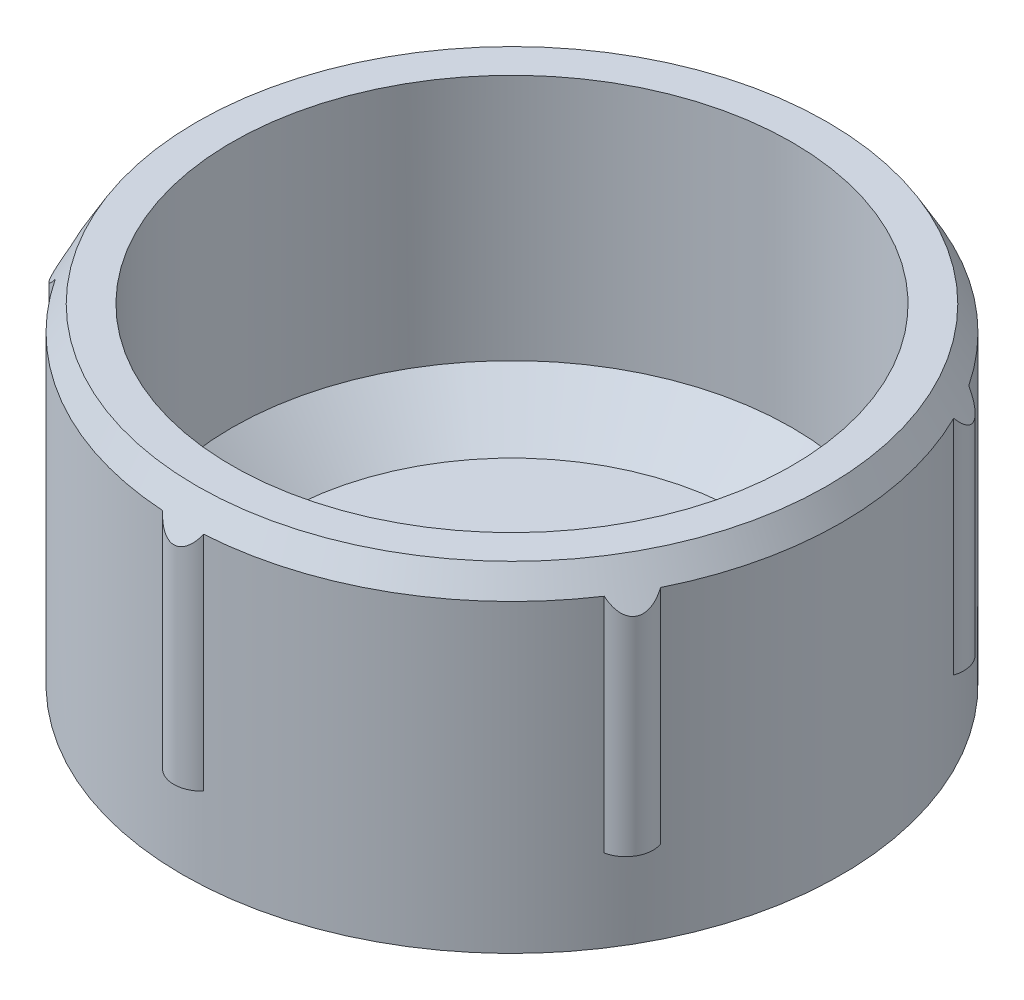
ISO-10303-21;
HEADER;
FILE_DESCRIPTION(('STEP AP214'),'2;1');
FILE_NAME('part.step','',(''),(''),'','','');
FILE_SCHEMA(('AUTOMOTIVE_DESIGN { 1 0 10303 214 1 1 1 1 }'));
ENDSEC;
DATA;
#1=APPLICATION_CONTEXT('core data for automotive mechanical design processes');
#2=APPLICATION_PROTOCOL_DEFINITION('international standard','automotive_design',2000,#1);
#3=PRODUCT_CONTEXT('',#1,'mechanical');
#4=PRODUCT('Part','Part','',(#3));
#5=PRODUCT_RELATED_PRODUCT_CATEGORY('part','',(#4));
#6=PRODUCT_DEFINITION_FORMATION('','',#4);
#7=PRODUCT_DEFINITION_CONTEXT('part definition',#1,'design');
#8=PRODUCT_DEFINITION('design','',#6,#7);
#9=PRODUCT_DEFINITION_SHAPE('','',#8);
#10=(LENGTH_UNIT() NAMED_UNIT(*) SI_UNIT(.MILLI.,.METRE.));
#11=(NAMED_UNIT(*) PLANE_ANGLE_UNIT() SI_UNIT($,.RADIAN.));
#12=(NAMED_UNIT(*) SI_UNIT($,.STERADIAN.) SOLID_ANGLE_UNIT());
#13=UNCERTAINTY_MEASURE_WITH_UNIT(LENGTH_MEASURE(1.E-05),#10,'distance_accuracy_value','');
#14=(GEOMETRIC_REPRESENTATION_CONTEXT(3) GLOBAL_UNCERTAINTY_ASSIGNED_CONTEXT((#13)) GLOBAL_UNIT_ASSIGNED_CONTEXT((#10,
#11,#12)) REPRESENTATION_CONTEXT('',''));
#15=CARTESIAN_POINT('',(0.,0.,0.));
#16=DIRECTION('',(0.,0.,1.));
#17=DIRECTION('',(1.,0.,0.));
#18=AXIS2_PLACEMENT_3D('',#15,#16,#17);
#19=CARTESIAN_POINT('',(-20.,20.,0.));
#20=DIRECTION('',(0.,-1.,0.));
#21=DIRECTION('',(0.,0.,-1.));
#22=AXIS2_PLACEMENT_3D('',#19,#20,#21);
#23=PLANE('',#22);
#24=CARTESIAN_POINT('',(0.,20.,0.));
#25=DIRECTION('',(0.,-1.,0.));
#26=DIRECTION('',(0.,0.,-1.));
#27=AXIS2_PLACEMENT_3D('',#24,#25,#26);
#28=CIRCLE('',#27,17.);
#29=CARTESIAN_POINT('',(0.,20.,-17.));
#30=VERTEX_POINT('',#29);
#31=EDGE_CURVE('E249',#30,#30,#28,.T.);
#32=ORIENTED_EDGE('',*,*,#31,.T.);
#33=EDGE_LOOP('',(#32));
#34=FACE_BOUND('',#33,.T.);
#35=CARTESIAN_POINT('',(0.,20.,0.));
#36=DIRECTION('',(0.,-1.,0.));
#37=DIRECTION('',(0.,0.,-1.));
#38=AXIS2_PLACEMENT_3D('',#35,#36,#37);
#39=CIRCLE('',#38,19.1339745962156);
#40=CARTESIAN_POINT('',(0.,20.,-19.1339745962156));
#41=VERTEX_POINT('',#40);
#42=EDGE_CURVE('E380',#41,#41,#39,.F.);
#43=ORIENTED_EDGE('',*,*,#42,.T.);
#44=EDGE_LOOP('',(#43));
#45=FACE_BOUND('',#44,.T.);
#46=ADVANCED_FACE('F48',(#34,#45),#23,.F.);
#47=CARTESIAN_POINT('',(0.,0.,0.));
#48=DIRECTION('',(0.,-1.,0.));
#49=DIRECTION('',(0.,0.,-1.));
#50=AXIS2_PLACEMENT_3D('',#47,#48,#49);
#51=CYLINDRICAL_SURFACE('',#50,17.);
#52=CARTESIAN_POINT('',(0.,5.00000000000002,0.));
#53=DIRECTION('',(0.,-1.,0.));
#54=DIRECTION('',(0.,0.,-1.));
#55=AXIS2_PLACEMENT_3D('',#52,#53,#54);
#56=CIRCLE('',#55,17.);
#57=CARTESIAN_POINT('',(0.,5.00000000000002,17.));
#58=VERTEX_POINT('',#57);
#59=EDGE_CURVE('E58',#58,#58,#56,.T.);
#60=ORIENTED_EDGE('',*,*,#59,.T.);
#61=EDGE_LOOP('',(#60));
#62=FACE_BOUND('',#61,.T.);
#63=ORIENTED_EDGE('',*,*,#31,.F.);
#64=EDGE_LOOP('',(#63));
#65=FACE_BOUND('',#64,.T.);
#66=ADVANCED_FACE('F333',(#62,#65),#51,.F.);
#67=CARTESIAN_POINT('',(-17.,2.,0.));
#68=DIRECTION('',(0.,-1.,0.));
#69=DIRECTION('',(0.,0.,-1.));
#70=AXIS2_PLACEMENT_3D('',#67,#68,#69);
#71=PLANE('',#70);
#72=CARTESIAN_POINT('',(0.,2.,0.));
#73=DIRECTION('',(0.,-1.,0.));
#74=DIRECTION('',(0.,0.,-1.));
#75=AXIS2_PLACEMENT_3D('',#72,#73,#74);
#76=CIRCLE('',#75,14.);
#77=CARTESIAN_POINT('',(0.,2.,14.));
#78=VERTEX_POINT('',#77);
#79=EDGE_CURVE('E12',#78,#78,#76,.F.);
#80=ORIENTED_EDGE('',*,*,#79,.T.);
#81=EDGE_LOOP('',(#80));
#82=FACE_BOUND('',#81,.T.);
#83=CARTESIAN_POINT('',(0.,2.,-9.5));
#84=DIRECTION('',(0.,1.,0.));
#85=DIRECTION('',(0.,0.,1.));
#86=AXIS2_PLACEMENT_3D('',#83,#84,#85);
#87=CIRCLE('',#86,1.7);
#88=CARTESIAN_POINT('',(0.,2.,-7.8));
#89=VERTEX_POINT('',#88);
#90=EDGE_CURVE('E374',#89,#89,#87,.T.);
#91=ORIENTED_EDGE('',*,*,#90,.F.);
#92=EDGE_LOOP('',(#91));
#93=FACE_BOUND('',#92,.T.);
#94=CARTESIAN_POINT('',(8.22724133595217,2.,4.75));
#95=DIRECTION('',(0.,1.,0.));
#96=DIRECTION('',(0.,0.,1.));
#97=AXIS2_PLACEMENT_3D('',#94,#95,#96);
#98=CIRCLE('',#97,1.7);
#99=CARTESIAN_POINT('',(8.22724133595217,2.,6.45));
#100=VERTEX_POINT('',#99);
#101=EDGE_CURVE('E369',#100,#100,#98,.T.);
#102=ORIENTED_EDGE('',*,*,#101,.F.);
#103=EDGE_LOOP('',(#102));
#104=FACE_BOUND('',#103,.T.);
#105=CARTESIAN_POINT('',(-8.22724133595217,2.,4.75));
#106=DIRECTION('',(0.,1.,0.));
#107=DIRECTION('',(0.,0.,1.));
#108=AXIS2_PLACEMENT_3D('',#105,#106,#107);
#109=CIRCLE('',#108,1.7);
#110=CARTESIAN_POINT('',(-8.22724133595217,2.,6.45));
#111=VERTEX_POINT('',#110);
#112=EDGE_CURVE('E363',#111,#111,#109,.T.);
#113=ORIENTED_EDGE('',*,*,#112,.F.);
#114=EDGE_LOOP('',(#113));
#115=FACE_BOUND('',#114,.T.);
#116=ADVANCED_FACE('F267',(#82,#93,#104,#115),#71,.F.);
#117=CARTESIAN_POINT('',(0.,16.7679491924311,0.));
#118=DIRECTION('',(0.,-1.,0.));
#119=DIRECTION('',(0.,0.,-1.));
#120=AXIS2_PLACEMENT_3D('',#117,#118,#119);
#121=CONICAL_SURFACE('',#120,21.,0.523598775598293);
#122=CARTESIAN_POINT('',(16.6614458574241,18.5002485549973,11.063023177637));
#123=CARTESIAN_POINT('',(16.7050752169426,18.4460441117612,11.0538848450894));
#124=CARTESIAN_POINT('',(16.7493546687067,18.392603565286,11.0428446734662));
#125=CARTESIAN_POINT('',(16.8393537476432,18.2876064348433,11.0162401508703));
#126=CARTESIAN_POINT('',(16.8850798726965,18.2360616136409,11.0006516357192));
#127=CARTESIAN_POINT('',(16.9784940793651,18.1348854032795,10.9639784491414));
#128=CARTESIAN_POINT('',(17.0262028081633,18.0853070644809,10.9427974202773));
#129=CARTESIAN_POINT('',(17.1223835440837,17.9902679779011,10.8942413858905));
#130=CARTESIAN_POINT('',(17.1708534283482,17.9447975702463,10.866881470542));
#131=CARTESIAN_POINT('',(17.2629237507927,17.8639272859373,10.8082357912521));
#132=CARTESIAN_POINT('',(17.3064920614992,17.8279705677542,10.7776801785353));
#133=CARTESIAN_POINT('',(17.3930298748308,17.7620800866797,10.7101908319978));
#134=CARTESIAN_POINT('',(17.4360009192559,17.7321260791174,10.6732793448367));
#135=CARTESIAN_POINT('',(17.5209077099318,17.6796544583551,10.5919991135138));
#136=CARTESIAN_POINT('',(17.5628207576708,17.6572460185922,10.5475338294839));
#137=CARTESIAN_POINT('',(17.6431012712468,17.6226984545939,10.4518759929717));
#138=CARTESIAN_POINT('',(17.6814739168468,17.6105441089594,10.4006935425777));
#139=CARTESIAN_POINT('',(17.7481939720697,17.5988159444379,10.2998767013877));
#140=CARTESIAN_POINT('',(17.777194318439,17.5978722307029,10.2508336056014));
#141=CARTESIAN_POINT('',(17.8298016723934,17.6051414762326,10.1505747940848));
#142=CARTESIAN_POINT('',(17.8534072041756,17.6133569374724,10.0993584883847));
#143=CARTESIAN_POINT('',(17.8926454980458,17.6367946223471,10.0019459339064));
#144=CARTESIAN_POINT('',(17.9088491950159,17.651207513961,9.95577627686844));
#145=CARTESIAN_POINT('',(17.9367181222699,17.6856718556566,9.86425261492679));
#146=CARTESIAN_POINT('',(17.9483851851794,17.7057210232486,9.81889828773776));
#147=CARTESIAN_POINT('',(17.9733065294979,17.7637183332333,9.7030685213726));
#148=CARTESIAN_POINT('',(17.9833785184594,17.8052202725063,9.63369380250167));
#149=CARTESIAN_POINT('',(17.9950601946314,17.8965382742945,9.49944401282476));
#150=CARTESIAN_POINT('',(17.9966112996574,17.9464094697863,9.43460311036354));
#151=CARTESIAN_POINT('',(17.993458313599,18.0369577516097,9.32748368550407));
#152=CARTESIAN_POINT('',(17.9903879242271,18.0762858567764,9.28398109404918));
#153=CARTESIAN_POINT('',(17.981270127857,18.1572512953586,9.19944503001775));
#154=CARTESIAN_POINT('',(17.9752200376268,18.1988906800472,9.15841382037493));
#155=CARTESIAN_POINT('',(17.9607280463362,18.2831149983173,9.07951939185912));
#156=CARTESIAN_POINT('',(17.9523352414975,18.3256655082765,9.04160990674668));
#157=CARTESIAN_POINT('',(17.9334510679885,18.4120549920721,8.96803868548566));
#158=CARTESIAN_POINT('',(17.9229644595775,18.4558908542224,8.93237208770615));
#159=CARTESIAN_POINT('',(17.9115801020155,18.5002561148836,8.89771788443911));
#160=B_SPLINE_CURVE_WITH_KNOTS('',3,(#122,#123,#124,#125,#126,#127,#128,#129,#130,#131,#132,
#133,#134,#135,#136,#137,#138,#139,#140,#141,#142,#143,#144,#145,#146,#147,#148,#149,#150,#151,
#152,#153,#154,#155,#156,#157,#158,#159),.UNSPECIFIED.,.F.,.F.,(4,2,2,2,2,2,2,2,2,2,2,2,2,2,2,2,
2,2,4),(0.,0.210597992545269,0.422335869730759,0.637991487990723,0.85312601747862,
1.04531068216788,1.23683585529953,1.43102369484273,1.62492276801379,1.79484329595462,
1.96481025178096,2.11726127883634,2.26965065740473,2.51266529799414,2.75734862424257,
2.93334554214907,3.10950123653627,3.28221148128513,3.45453345120374),.UNSPECIFIED.);
#161=CARTESIAN_POINT('',(16.6616458574241,18.5,11.0629813939002));
#162=VERTEX_POINT('',#161);
#163=CARTESIAN_POINT('',(17.9116458574241,18.5,8.8979178844391));
#164=VERTEX_POINT('',#163);
#165=EDGE_CURVE('E305',#162,#164,#160,.T.);
#166=ORIENTED_EDGE('',*,*,#165,.T.);
#167=CARTESIAN_POINT('',(0.,18.5,0.));
#168=DIRECTION('',(0.,-1.,0.));
#169=DIRECTION('',(0.,0.,-1.));
#170=AXIS2_PLACEMENT_3D('',#167,#168,#169);
#171=CIRCLE('',#170,20.);
#172=CARTESIAN_POINT('',(17.9116458574242,18.5,-8.89791788443898));
#173=VERTEX_POINT('',#172);
#174=EDGE_CURVE('E372',#173,#164,#171,.T.);
#175=ORIENTED_EDGE('',*,*,#174,.F.);
#176=CARTESIAN_POINT('',(17.9115801020156,18.5002561148836,-8.89771788443898));
#177=CARTESIAN_POINT('',(17.9254808807644,18.4460515969766,-8.94007104126829));
#178=CARTESIAN_POINT('',(17.9380596743222,18.3926109673263,-8.98393810833626));
#179=CARTESIAN_POINT('',(17.9600193212867,18.2876136489493,-9.07518154307489));
#180=CARTESIAN_POINT('',(17.9693824973827,18.2360687225765,-9.12257561970793));
#181=CARTESIAN_POINT('',(17.9843300540941,18.1348922749377,-9.22181092600011));
#182=CARTESIAN_POINT('',(17.9898413121246,18.0853138024768,-9.27371821410668));
#183=CARTESIAN_POINT('',(17.9958813778079,17.9902743849536,-9.38129078930672));
#184=CARTESIAN_POINT('',(17.9964221921013,17.9448037803904,-9.43694669311006));
#185=CARTESIAN_POINT('',(17.9916692351095,17.8639328357423,-9.54600465936615));
#186=CARTESIAN_POINT('',(17.9869916972062,17.8279756865533,-9.59901383916501));
#187=CARTESIAN_POINT('',(17.9718135915255,17.7620843174456,-9.70770273191658));
#188=CARTESIAN_POINT('',(17.9613330603131,17.7321298534853,-9.76337265686646));
#189=CARTESIAN_POINT('',(17.933396146181,17.679657300708,-9.87754461789268));
#190=CARTESIAN_POINT('',(17.9158448072299,17.6572483855878,-9.93607526752394));
#191=CARTESIAN_POINT('',(17.8731432849291,17.622699899656,-10.0534297212016));
#192=CARTESIAN_POINT('',(17.8480044406636,17.610545106821,-10.1122529598577));
#193=CARTESIAN_POINT('',(17.7940546809756,17.5988161877668,-10.2204433174379));
#194=CARTESIAN_POINT('',(17.7660823230169,17.5978721554722,-10.2700802408856));
#195=CARTESIAN_POINT('',(17.7055593088623,17.6051408682095,-10.365769644645));
#196=CARTESIAN_POINT('',(17.6730074039104,17.6133561150493,-10.4118211419403));
#197=CARTESIAN_POINT('',(17.6082648166084,17.6367934396305,-10.49450920858));
#198=CARTESIAN_POINT('',(17.5763826515598,17.651206137236,-10.5316269507107));
#199=CARTESIAN_POINT('',(17.5110554390408,17.6856701155201,-10.6015241921128));
#200=CARTESIAN_POINT('',(17.4776110287974,17.7057191136579,-10.6343054396542));
#201=CARTESIAN_POINT('',(17.3897605487891,17.7637158562954,-10.713802909268));
#202=CARTESIAN_POINT('',(17.334716579217,17.8052173644128,-10.7572128745264));
#203=CARTESIAN_POINT('',(17.2242942659588,17.8965344929651,-10.834454477853));
#204=CARTESIAN_POINT('',(17.1689162215902,17.9464052462236,-10.8682182986648));
#205=CARTESIAN_POINT('',(17.0745719675537,18.0369528268085,-10.9190476400741));
#206=CARTESIAN_POINT('',(17.0353625419213,18.0762806766865,-10.9381400054225));
#207=CARTESIAN_POINT('',(16.9575934898759,18.1572456131869,-10.972512010822));
#208=CARTESIAN_POINT('',(16.9190344815991,18.1988847511047,-10.9877881956404));
#209=CARTESIAN_POINT('',(16.843464107618,18.283108588762,-11.0146852042299));
#210=CARTESIAN_POINT('',(16.8064372224905,18.3256588647834,-11.0263716795148));
#211=CARTESIAN_POINT('',(16.7332807703643,18.4120478864037,-11.0468033498341));
#212=CARTESIAN_POINT('',(16.6971493732053,18.4558835202828,-11.0555550982231));
#213=CARTESIAN_POINT('',(16.6614458574242,18.5002485549973,-11.0630231776369));
#214=B_SPLINE_CURVE_WITH_KNOTS('',3,(#176,#177,#178,#179,#180,#181,#182,#183,#184,#185,#186,
#187,#188,#189,#190,#191,#192,#193,#194,#195,#196,#197,#198,#199,#200,#201,#202,#203,#204,#205,
#206,#207,#208,#209,#210,#211,#212,#213),.UNSPECIFIED.,.F.,.F.,(4,2,2,2,2,2,2,2,2,2,2,2,2,2,2,2,
2,2,4),(0.,0.210597980437397,0.422335820045451,0.637991339465621,0.853125782494906,
1.04531139108324,1.23683752267063,1.43102634415399,1.62492638671836,1.79484774858586,
1.96481553493288,2.11726646037544,2.2696557362633,2.51266912001853,2.75735117772154,
2.93334744735675,3.10950249402306,3.28221210799801,3.45453344600408),.UNSPECIFIED.);
#215=CARTESIAN_POINT('',(16.6616458574242,18.5,-11.0629813939001));
#216=VERTEX_POINT('',#215);
#217=EDGE_CURVE('E297',#173,#216,#214,.T.);
#218=ORIENTED_EDGE('',*,*,#217,.T.);
#219=CARTESIAN_POINT('',(1.25,18.5,-19.9608992783391));
#220=VERTEX_POINT('',#219);
#221=EDGE_CURVE('E382',#220,#216,#171,.T.);
#222=ORIENTED_EDGE('',*,*,#221,.F.);
#223=CARTESIAN_POINT('',(1.25017881646399,18.5003263738879,-19.9606992783391));
#224=CARTESIAN_POINT('',(1.2204520389792,18.4461211623595,-19.9939146420949));
#225=CARTESIAN_POINT('',(1.18875327484855,18.3926797600504,-20.0267421393141));
#226=CARTESIAN_POINT('',(1.12071789706236,18.2876806957532,-20.0913824174656));
#227=CARTESIAN_POINT('',(1.08435711452948,18.2361347922958,-20.1231887461106));
#228=CARTESIAN_POINT('',(1.00589521278435,18.1349561395816,-20.1857526104401));
#229=CARTESIAN_POINT('',(0.963700342458413,18.0853764247092,-20.2164798580614));
#230=CARTESIAN_POINT('',(0.87356515619146,17.9903339312114,-20.2754988033526));
#231=CARTESIAN_POINT('',(0.825638965880885,17.9448614965495,-20.3037962053164));
#232=CARTESIAN_POINT('',(0.728818877763087,17.863984414866,-20.3542127532876));
#233=CARTESIAN_POINT('',(0.680573062397872,17.8280232600296,-20.3766689461927));
#234=CARTESIAN_POINT('',(0.57885666900052,17.7621236379582,-20.4178738771415));
#235=CARTESIAN_POINT('',(0.52540458285724,17.7321649325058,-20.4366350697004));
#236=CARTESIAN_POINT('',(0.412559050678892,17.67968371807,-20.469532373802));
#237=CARTESIAN_POINT('',(0.353093333931579,17.6572703852009,-20.4836005565191));
#238=CARTESIAN_POINT('',(0.230107605052278,17.6227133311407,-20.5053025502856));
#239=CARTESIAN_POINT('',(0.166593755820161,17.6105543821488,-20.5129459021783));
#240=CARTESIAN_POINT('',(0.0459185875634921,17.5988184507222,-20.5203236256261));
#241=CARTESIAN_POINT('',(-0.0110569891482514,17.597871457773,-20.5209191767514));
#242=CARTESIAN_POINT('',(-0.124193591362851,17.6051352186891,-20.5163525236008));
#243=CARTESIAN_POINT('',(-0.180354390215313,17.613348473032,-20.5111887471983));
#244=CARTESIAN_POINT('',(-0.284339058674095,17.6367824505442,-20.4964661543024));
#245=CARTESIAN_POINT('',(-0.332425478490972,17.6511933468605,-20.4874153887081));
#246=CARTESIAN_POINT('',(-0.425622921682066,17.6856539489735,-20.4657910935605));
#247=CARTESIAN_POINT('',(-0.470735141123434,17.7057013707688,-20.4532189909116));
#248=CARTESIAN_POINT('',(-0.583506015602156,17.7636928207027,-20.4168902741872));
#249=CARTESIAN_POINT('',(-0.648620745504543,17.805190297905,-20.3909282844768));
#250=CARTESIAN_POINT('',(-0.770723063147843,17.896499300536,-20.3339255803212));
#251=CARTESIAN_POINT('',(-0.827651766303834,17.9463659659577,-20.3028512119273));
#252=CARTESIAN_POINT('',(-0.918853819454822,18.0369175844986,-20.2465587823413));
#253=CARTESIAN_POINT('',(-0.955002784312392,18.076254390845,-20.2221430247999));
#254=CARTESIAN_POINT('',(-1.02367210157942,18.15723845434,-20.1719671781323));
#255=CARTESIAN_POINT('',(-1.05618914783647,18.198887765774,-20.1462058949697));
#256=CARTESIAN_POINT('',(-1.11728186900656,18.2831323147468,-20.0941957693513));
#257=CARTESIAN_POINT('',(-1.14592220939944,18.3256931025998,-20.0679663269803));
#258=CARTESIAN_POINT('',(-1.20020563524944,18.4121036038833,-20.0148136722791));
#259=CARTESIAN_POINT('',(-1.22585531940734,18.4559502018351,-19.9878921536808));
#260=CARTESIAN_POINT('',(-1.25017881646398,18.5003263738879,-19.9606992783391));
#261=B_SPLINE_CURVE_WITH_KNOTS('',3,(#223,#224,#225,#226,#227,#228,#229,#230,#231,#232,#233,
#234,#235,#236,#237,#238,#239,#240,#241,#242,#243,#244,#245,#246,#247,#248,#249,#250,#251,#252,
#253,#254,#255,#256,#257,#258,#259,#260),.UNSPECIFIED.,.F.,.F.,(4,2,2,2,2,2,2,2,2,2,2,2,2,2,2,2,
2,2,4),(0.,0.210597866763949,0.422335356019849,0.637989958135129,0.853123598903909,
1.04531798039797,1.23685301942272,1.43105096672521,1.62496001895714,1.79488912964143,
1.96486463731889,2.11731463232798,2.26970294121215,2.51270451573415,2.75737491593322,
2.93341402725958,3.10961210377062,3.28236288310703,3.45472498108615),.UNSPECIFIED.);
#262=CARTESIAN_POINT('',(-1.25,18.5,-19.9608992783391));
#263=VERTEX_POINT('',#262);
#264=EDGE_CURVE('E283',#220,#263,#261,.T.);
#265=ORIENTED_EDGE('',*,*,#264,.T.);
#266=CARTESIAN_POINT('',(-16.661645857424,18.5,-11.0629813939003));
#267=VERTEX_POINT('',#266);
#268=EDGE_CURVE('E65',#267,#263,#171,.T.);
#269=ORIENTED_EDGE('',*,*,#268,.F.);
#270=CARTESIAN_POINT('',(-16.661445857424,18.5002485549973,-11.0630231776371));
#271=CARTESIAN_POINT('',(-16.7050752169425,18.4460441117612,-11.0538848450895));
#272=CARTESIAN_POINT('',(-16.7493546687067,18.392603565286,-11.0428446734663));
#273=CARTESIAN_POINT('',(-16.8393537476431,18.2876064348433,-11.0162401508704));
#274=CARTESIAN_POINT('',(-16.8850798726964,18.2360616136409,-11.0006516357193));
#275=CARTESIAN_POINT('',(-16.978494079365,18.1348854032795,-10.9639784491415));
#276=CARTESIAN_POINT('',(-17.0262028081633,18.0853070644809,-10.9427974202774));
#277=CARTESIAN_POINT('',(-17.1223835440836,17.9902679779011,-10.8942413858906));
#278=CARTESIAN_POINT('',(-17.1708534283482,17.9447975702463,-10.8668814705421));
#279=CARTESIAN_POINT('',(-17.2629237507926,17.8639272859373,-10.8082357912522));
#280=CARTESIAN_POINT('',(-17.3064920614992,17.8279705677542,-10.7776801785354));
#281=CARTESIAN_POINT('',(-17.3930298748307,17.7620800866797,-10.710190831998));
#282=CARTESIAN_POINT('',(-17.4360009192558,17.7321260791174,-10.6732793448368));
#283=CARTESIAN_POINT('',(-17.5209077099317,17.6796544583551,-10.5919991135139));
#284=CARTESIAN_POINT('',(-17.5628207576707,17.6572460185922,-10.547533829484));
#285=CARTESIAN_POINT('',(-17.6431012712467,17.6226984545939,-10.4518759929718));
#286=CARTESIAN_POINT('',(-17.6814739168467,17.6105441089594,-10.4006935425778));
#287=CARTESIAN_POINT('',(-17.7481939720696,17.5988159444379,-10.2998767013878));
#288=CARTESIAN_POINT('',(-17.7771943184389,17.5978722307029,-10.2508336056015));
#289=CARTESIAN_POINT('',(-17.8298016723933,17.6051414762326,-10.150574794085));
#290=CARTESIAN_POINT('',(-17.8534072041755,17.6133569374724,-10.0993584883848));
#291=CARTESIAN_POINT('',(-17.8926454980458,17.6367946223471,-10.0019459339065));
#292=CARTESIAN_POINT('',(-17.9088491950159,17.651207513961,-9.95577627686857));
#293=CARTESIAN_POINT('',(-17.9367181222698,17.6856718556566,-9.86425261492691));
#294=CARTESIAN_POINT('',(-17.9483851851793,17.7057210232486,-9.81889828773789));
#295=CARTESIAN_POINT('',(-17.9733065294978,17.7637183332333,-9.70306852137272));
#296=CARTESIAN_POINT('',(-17.9833785184593,17.8052202725063,-9.63369380250179));
#297=CARTESIAN_POINT('',(-17.9950601946313,17.8965382742945,-9.49944401282488));
#298=CARTESIAN_POINT('',(-17.9966112996574,17.9464094697863,-9.43460311036366));
#299=CARTESIAN_POINT('',(-17.9934583135989,18.0369577516097,-9.32748368550419));
#300=CARTESIAN_POINT('',(-17.990387924227,18.0762858567764,-9.2839810940493));
#301=CARTESIAN_POINT('',(-17.9812701278569,18.1572512953586,-9.19944503001788));
#302=CARTESIAN_POINT('',(-17.9752200376267,18.1988906800472,-9.15841382037505));
#303=CARTESIAN_POINT('',(-17.9607280463361,18.2831149983173,-9.07951939185924));
#304=CARTESIAN_POINT('',(-17.9523352414974,18.3256655082765,-9.04160990674679));
#305=CARTESIAN_POINT('',(-17.9334510679885,18.4120549920722,-8.96803868548578));
#306=CARTESIAN_POINT('',(-17.9229644595774,18.4558908542225,-8.93237208770626));
#307=CARTESIAN_POINT('',(-17.9115801020155,18.5002561148836,-8.89771788443922));
#308=B_SPLINE_CURVE_WITH_KNOTS('',3,(#270,#271,#272,#273,#274,#275,#276,#277,#278,#279,#280,
#281,#282,#283,#284,#285,#286,#287,#288,#289,#290,#291,#292,#293,#294,#295,#296,#297,#298,#299,
#300,#301,#302,#303,#304,#305,#306,#307),.UNSPECIFIED.,.F.,.F.,(4,2,2,2,2,2,2,2,2,2,2,2,2,2,2,2,
2,2,4),(0.,0.210597992545264,0.422335869730753,0.637991487990722,0.853126017478619,
1.04531068216788,1.23683585529953,1.43102369484272,1.62492276801378,1.79484329595462,
1.96481025178095,2.11726127883633,2.26965065740472,2.51266529799414,2.75734862424257,
2.93334554214906,3.10950123653626,3.28221148128513,3.45453345120374),.UNSPECIFIED.);
#309=CARTESIAN_POINT('',(-17.9116458574241,18.5,-8.89791788443923));
#310=VERTEX_POINT('',#309);
#311=EDGE_CURVE('E137',#267,#310,#308,.T.);
#312=ORIENTED_EDGE('',*,*,#311,.T.);
#313=CARTESIAN_POINT('',(-17.9116458574242,18.5,8.89791788443886));
#314=VERTEX_POINT('',#313);
#315=EDGE_CURVE('E140',#314,#310,#171,.T.);
#316=ORIENTED_EDGE('',*,*,#315,.F.);
#317=CARTESIAN_POINT('',(-17.9115801020156,18.5002561148836,8.89771788443886));
#318=CARTESIAN_POINT('',(-17.9254808807645,18.4460515969766,8.94007104126817));
#319=CARTESIAN_POINT('',(-17.9380596743223,18.3926109673263,8.98393810833613));
#320=CARTESIAN_POINT('',(-17.9600193212868,18.2876136489493,9.07518154307477));
#321=CARTESIAN_POINT('',(-17.9693824973827,18.2360687225765,9.1225756197078));
#322=CARTESIAN_POINT('',(-17.9843300540941,18.1348922749377,9.22181092599999));
#323=CARTESIAN_POINT('',(-17.9898413121246,18.0853138024768,9.27371821410657));
#324=CARTESIAN_POINT('',(-17.9958813778079,17.9902743849536,9.3812907893066));
#325=CARTESIAN_POINT('',(-17.9964221921014,17.9448037803904,9.43694669310993));
#326=CARTESIAN_POINT('',(-17.9916692351096,17.8639328357423,9.54600465936602));
#327=CARTESIAN_POINT('',(-17.9869916972062,17.8279756865533,9.59901383916489));
#328=CARTESIAN_POINT('',(-17.9718135915256,17.7620843174456,9.70770273191646));
#329=CARTESIAN_POINT('',(-17.9613330603131,17.7321298534853,9.76337265686634));
#330=CARTESIAN_POINT('',(-17.9333961461811,17.679657300708,9.87754461789256));
#331=CARTESIAN_POINT('',(-17.9158448072299,17.6572483855878,9.93607526752382));
#332=CARTESIAN_POINT('',(-17.8731432849291,17.622699899656,10.0534297212015));
#333=CARTESIAN_POINT('',(-17.8480044406636,17.610545106821,10.1122529598576));
#334=CARTESIAN_POINT('',(-17.7940546809756,17.5988161877668,10.2204433174378));
#335=CARTESIAN_POINT('',(-17.766082323017,17.5978721554722,10.2700802408855));
#336=CARTESIAN_POINT('',(-17.7055593088624,17.6051408682095,10.3657696446449));
#337=CARTESIAN_POINT('',(-17.6730074039105,17.6133561150493,10.4118211419402));
#338=CARTESIAN_POINT('',(-17.6082648166084,17.6367934396305,10.4945092085799));
#339=CARTESIAN_POINT('',(-17.5763826515598,17.6512061372361,10.5316269507106));
#340=CARTESIAN_POINT('',(-17.5110554390409,17.6856701155201,10.6015241921127));
#341=CARTESIAN_POINT('',(-17.4776110287975,17.7057191136579,10.6343054396541));
#342=CARTESIAN_POINT('',(-17.3897605487892,17.7637158562954,10.7138029092678));
#343=CARTESIAN_POINT('',(-17.3347165792171,17.8052173644128,10.7572128745263));
#344=CARTESIAN_POINT('',(-17.2242942659588,17.8965344929651,10.8344544778529));
#345=CARTESIAN_POINT('',(-17.1689162215903,17.9464052462236,10.8682182986647));
#346=CARTESIAN_POINT('',(-17.0745719675538,18.0369528268085,10.919047640074));
#347=CARTESIAN_POINT('',(-17.0353625419213,18.0762806766865,10.9381400054224));
#348=CARTESIAN_POINT('',(-16.957593489876,18.1572456131869,10.9725120108219));
#349=CARTESIAN_POINT('',(-16.9190344815992,18.1988847511047,10.9877881956403));
#350=CARTESIAN_POINT('',(-16.8434641076181,18.283108588762,11.0146852042298));
#351=CARTESIAN_POINT('',(-16.8064372224906,18.3256588647834,11.0263716795147));
#352=CARTESIAN_POINT('',(-16.7332807703644,18.4120478864037,11.046803349834));
#353=CARTESIAN_POINT('',(-16.6971493732054,18.4558835202828,11.0555550982229));
#354=CARTESIAN_POINT('',(-16.6614458574243,18.5002485549973,11.0630231776367));
#355=B_SPLINE_CURVE_WITH_KNOTS('',3,(#317,#318,#319,#320,#321,#322,#323,#324,#325,#326,#327,
#328,#329,#330,#331,#332,#333,#334,#335,#336,#337,#338,#339,#340,#341,#342,#343,#344,#345,#346,
#347,#348,#349,#350,#351,#352,#353,#354),.UNSPECIFIED.,.F.,.F.,(4,2,2,2,2,2,2,2,2,2,2,2,2,2,2,2,
2,2,4),(0.,0.210597980437398,0.42233582004546,0.637991339465629,0.853125782494912,
1.04531139108325,1.23683752267064,1.431026344154,1.62492638671836,1.79484774858586,
1.96481553493289,2.11726646037545,2.2696557362633,2.51266912001854,2.75735117772155,
2.93334744735676,3.10950249402307,3.28221210799801,3.45453344600408),.UNSPECIFIED.);
#356=CARTESIAN_POINT('',(-16.6616458574243,18.5,11.0629813939));
#357=VERTEX_POINT('',#356);
#358=EDGE_CURVE('E154',#314,#357,#355,.T.);
#359=ORIENTED_EDGE('',*,*,#358,.T.);
#360=CARTESIAN_POINT('',(-1.25000000000013,18.5,19.9608992783391));
#361=VERTEX_POINT('',#360);
#362=EDGE_CURVE('E156',#361,#357,#171,.T.);
#363=ORIENTED_EDGE('',*,*,#362,.F.);
#364=CARTESIAN_POINT('',(-1.25017881646412,18.5003263738879,19.9606992783391));
#365=CARTESIAN_POINT('',(-1.22045203897934,18.4461211623595,19.9939146420949));
#366=CARTESIAN_POINT('',(-1.18875327484869,18.3926797600504,20.0267421393141));
#367=CARTESIAN_POINT('',(-1.12071789706249,18.2876806957532,20.0913824174656));
#368=CARTESIAN_POINT('',(-1.08435711452961,18.2361347922958,20.1231887461106));
#369=CARTESIAN_POINT('',(-1.00589521278448,18.1349561395816,20.1857526104401));
#370=CARTESIAN_POINT('',(-0.96370034245855,18.0853764247092,20.2164798580614));
#371=CARTESIAN_POINT('',(-0.873565156191596,17.9903339312114,20.2754988033526));
#372=CARTESIAN_POINT('',(-0.825638965881018,17.9448614965495,20.3037962053164));
#373=CARTESIAN_POINT('',(-0.72881887776322,17.863984414866,20.3542127532876));
#374=CARTESIAN_POINT('',(-0.680573062398009,17.8280232600296,20.3766689461927));
#375=CARTESIAN_POINT('',(-0.578856669000656,17.7621236379582,20.4178738771415));
#376=CARTESIAN_POINT('',(-0.525404582857373,17.7321649325058,20.4366350697004));
#377=CARTESIAN_POINT('',(-0.412559050679024,17.67968371807,20.469532373802));
#378=CARTESIAN_POINT('',(-0.353093333931713,17.6572703852009,20.4836005565191));
#379=CARTESIAN_POINT('',(-0.230107605052413,17.6227133311407,20.5053025502856));
#380=CARTESIAN_POINT('',(-0.166593755820297,17.6105543821488,20.5129459021783));
#381=CARTESIAN_POINT('',(-0.045918587563628,17.5988184507222,20.5203236256261));
#382=CARTESIAN_POINT('',(0.0110569891481155,17.597871457773,20.5209191767514));
#383=CARTESIAN_POINT('',(0.124193591362714,17.6051352186891,20.5163525236008));
#384=CARTESIAN_POINT('',(0.180354390215176,17.613348473032,20.5111887471983));
#385=CARTESIAN_POINT('',(0.284339058673959,17.6367824505443,20.4964661543024));
#386=CARTESIAN_POINT('',(0.332425478490838,17.6511933468605,20.4874153887081));
#387=CARTESIAN_POINT('',(0.425622921681931,17.6856539489735,20.4657910935605));
#388=CARTESIAN_POINT('',(0.470735141123298,17.7057013707688,20.4532189909116));
#389=CARTESIAN_POINT('',(0.58350601560202,17.7636928207027,20.4168902741872));
#390=CARTESIAN_POINT('',(0.64862074550441,17.805190297905,20.3909282844768));
#391=CARTESIAN_POINT('',(0.770723063147713,17.896499300536,20.3339255803212));
#392=CARTESIAN_POINT('',(0.827651766303701,17.9463659659577,20.3028512119273));
#393=CARTESIAN_POINT('',(0.918853819454689,18.0369175844986,20.2465587823413));
#394=CARTESIAN_POINT('',(0.955002784312261,18.076254390845,20.2221430247999));
#395=CARTESIAN_POINT('',(1.02367210157929,18.1572384543401,20.1719671781323));
#396=CARTESIAN_POINT('',(1.05618914783634,18.198887765774,20.1462058949697));
#397=CARTESIAN_POINT('',(1.11728186900643,18.2831323147468,20.0941957693513));
#398=CARTESIAN_POINT('',(1.14592220939931,18.3256931025998,20.0679663269803));
#399=CARTESIAN_POINT('',(1.20020563524931,18.4121036038834,20.0148136722791));
#400=CARTESIAN_POINT('',(1.22585531940721,18.4559502018351,19.9878921536808));
#401=CARTESIAN_POINT('',(1.25017881646386,18.500326373888,19.9606992783391));
#402=B_SPLINE_CURVE_WITH_KNOTS('',3,(#364,#365,#366,#367,#368,#369,#370,#371,#372,#373,#374,
#375,#376,#377,#378,#379,#380,#381,#382,#383,#384,#385,#386,#387,#388,#389,#390,#391,#392,#393,
#394,#395,#396,#397,#398,#399,#400,#401),.UNSPECIFIED.,.F.,.F.,(4,2,2,2,2,2,2,2,2,2,2,2,2,2,2,2,
2,2,4),(0.,0.210597866763952,0.42233535601985,0.637989958135127,0.853123598903907,
1.04531798039797,1.23685301942272,1.43105096672521,1.62496001895714,1.79488912964142,
1.96486463731888,2.11731463232798,2.26970294121214,2.51270451573415,2.75737491593322,
2.93341402725959,3.10961210377063,3.28236288310704,3.45472498108617),.UNSPECIFIED.);
#403=CARTESIAN_POINT('',(1.24999999999986,18.5,19.9608992783392));
#404=VERTEX_POINT('',#403);
#405=EDGE_CURVE('E290',#361,#404,#402,.T.);
#406=ORIENTED_EDGE('',*,*,#405,.T.);
#407=EDGE_CURVE('E304',#162,#404,#171,.T.);
#408=ORIENTED_EDGE('',*,*,#407,.F.);
#409=EDGE_LOOP('',(#166,#175,#218,#222,#265,#269,#312,#316,#359,#363,#406,#408));
#410=FACE_BOUND('',#409,.T.);
#411=ORIENTED_EDGE('',*,*,#42,.F.);
#412=EDGE_LOOP('',(#411));
#413=FACE_BOUND('',#412,.T.);
#414=ADVANCED_FACE('F138',(#410,#413),#121,.T.);
#415=CARTESIAN_POINT('',(0.,0.,0.));
#416=DIRECTION('',(0.,1.,0.));
#417=DIRECTION('',(0.,0.,1.));
#418=AXIS2_PLACEMENT_3D('',#415,#416,#417);
#419=PLANE('',#418);
#420=CARTESIAN_POINT('',(0.,0.,-9.5));
#421=DIRECTION('',(0.,1.,0.));
#422=DIRECTION('',(0.,0.,1.));
#423=AXIS2_PLACEMENT_3D('',#420,#421,#422);
#424=CIRCLE('',#423,1.7);
#425=CARTESIAN_POINT('',(0.,0.,-7.8));
#426=VERTEX_POINT('',#425);
#427=EDGE_CURVE('E351',#426,#426,#424,.F.);
#428=ORIENTED_EDGE('',*,*,#427,.F.);
#429=EDGE_LOOP('',(#428));
#430=FACE_BOUND('',#429,.T.);
#431=CARTESIAN_POINT('',(8.22724133595217,0.,4.75));
#432=DIRECTION('',(0.,1.,0.));
#433=DIRECTION('',(0.,0.,1.));
#434=AXIS2_PLACEMENT_3D('',#431,#432,#433);
#435=CIRCLE('',#434,1.7);
#436=CARTESIAN_POINT('',(8.22724133595217,0.,6.45));
#437=VERTEX_POINT('',#436);
#438=EDGE_CURVE('E355',#437,#437,#435,.F.);
#439=ORIENTED_EDGE('',*,*,#438,.F.);
#440=EDGE_LOOP('',(#439));
#441=FACE_BOUND('',#440,.T.);
#442=CARTESIAN_POINT('',(-8.22724133595217,0.,4.75));
#443=DIRECTION('',(0.,1.,0.));
#444=DIRECTION('',(0.,0.,1.));
#445=AXIS2_PLACEMENT_3D('',#442,#443,#444);
#446=CIRCLE('',#445,1.7);
#447=CARTESIAN_POINT('',(-8.22724133595217,0.,6.45));
#448=VERTEX_POINT('',#447);
#449=EDGE_CURVE('E359',#448,#448,#446,.F.);
#450=ORIENTED_EDGE('',*,*,#449,.F.);
#451=EDGE_LOOP('',(#450));
#452=FACE_BOUND('',#451,.T.);
#453=CARTESIAN_POINT('',(0.,0.,0.));
#454=DIRECTION('',(0.,-1.,0.));
#455=DIRECTION('',(0.,0.,-1.));
#456=AXIS2_PLACEMENT_3D('',#453,#454,#455);
#457=CIRCLE('',#456,20.);
#458=CARTESIAN_POINT('',(0.,0.,-20.));
#459=VERTEX_POINT('',#458);
#460=EDGE_CURVE('E146',#459,#459,#457,.T.);
#461=ORIENTED_EDGE('',*,*,#460,.T.);
#462=EDGE_LOOP('',(#461));
#463=FACE_BOUND('',#462,.T.);
#464=ADVANCED_FACE('F266',(#430,#441,#452,#463),#419,.F.);
#465=CARTESIAN_POINT('',(0.,5.,0.));
#466=DIRECTION('',(0.,1.,0.));
#467=DIRECTION('',(0.,0.,1.));
#468=AXIS2_PLACEMENT_3D('',#465,#466,#467);
#469=PLANE('',#468);
#470=CARTESIAN_POINT('',(0.,5.,0.));
#471=DIRECTION('',(0.,1.,0.));
#472=DIRECTION('',(0.,0.,1.));
#473=AXIS2_PLACEMENT_3D('',#470,#471,#472);
#474=CIRCLE('',#473,20.);
#475=CARTESIAN_POINT('',(1.25,5.,-19.9608992783391));
#476=VERTEX_POINT('',#475);
#477=CARTESIAN_POINT('',(-1.25,5.,-19.9608992783391));
#478=VERTEX_POINT('',#477);
#479=EDGE_CURVE('E235',#476,#478,#474,.T.);
#480=ORIENTED_EDGE('',*,*,#479,.T.);
#481=CARTESIAN_POINT('',(0.,5.,-18.8431164401008));
#482=DIRECTION('',(0.,1.,0.));
#483=DIRECTION('',(0.,0.,1.));
#484=AXIS2_PLACEMENT_3D('',#481,#482,#483);
#485=CIRCLE('',#484,1.67688355989918);
#486=EDGE_CURVE('E239',#478,#476,#485,.F.);
#487=ORIENTED_EDGE('',*,*,#486,.T.);
#488=EDGE_LOOP('',(#480,#487));
#489=FACE_BOUND('',#488,.T.);
#490=ADVANCED_FACE('F323',(#489),#469,.F.);
#491=CARTESIAN_POINT('',(0.,5.,0.));
#492=DIRECTION('',(0.,1.,0.));
#493=DIRECTION('',(0.,0.,1.));
#494=AXIS2_PLACEMENT_3D('',#491,#492,#493);
#495=PLANE('',#494);
#496=CARTESIAN_POINT('',(16.3186175235955,5.,-9.42155822005037));
#497=DIRECTION('',(0.,1.,0.));
#498=DIRECTION('',(0.,0.,1.));
#499=AXIS2_PLACEMENT_3D('',#496,#497,#498);
#500=CIRCLE('',#499,1.67688355989918);
#501=CARTESIAN_POINT('',(16.6616458574242,5.,-11.0629813939001));
#502=VERTEX_POINT('',#501);
#503=CARTESIAN_POINT('',(17.9116458574242,5.,-8.89791788443898));
#504=VERTEX_POINT('',#503);
#505=EDGE_CURVE('E222',#502,#504,#500,.F.);
#506=ORIENTED_EDGE('',*,*,#505,.T.);
#507=CARTESIAN_POINT('',(0.,5.,0.));
#508=DIRECTION('',(0.,1.,0.));
#509=DIRECTION('',(0.,0.,1.));
#510=AXIS2_PLACEMENT_3D('',#507,#508,#509);
#511=CIRCLE('',#510,20.);
#512=EDGE_CURVE('E211',#504,#502,#511,.T.);
#513=ORIENTED_EDGE('',*,*,#512,.T.);
#514=EDGE_LOOP('',(#506,#513));
#515=FACE_BOUND('',#514,.T.);
#516=ADVANCED_FACE('F320',(#515),#495,.F.);
#517=CARTESIAN_POINT('',(0.,5.,0.));
#518=DIRECTION('',(0.,1.,0.));
#519=DIRECTION('',(0.,0.,1.));
#520=AXIS2_PLACEMENT_3D('',#517,#518,#519);
#521=PLANE('',#520);
#522=CARTESIAN_POINT('',(16.3186175235955,5.,9.42155822005049));
#523=DIRECTION('',(0.,1.,0.));
#524=DIRECTION('',(0.,0.,1.));
#525=AXIS2_PLACEMENT_3D('',#522,#523,#524);
#526=CIRCLE('',#525,1.67688355989918);
#527=CARTESIAN_POINT('',(17.9116458574241,5.,8.89791788443911));
#528=VERTEX_POINT('',#527);
#529=CARTESIAN_POINT('',(16.6616458574241,5.,11.0629813939002));
#530=VERTEX_POINT('',#529);
#531=EDGE_CURVE('E206',#528,#530,#526,.F.);
#532=ORIENTED_EDGE('',*,*,#531,.T.);
#533=CARTESIAN_POINT('',(0.,5.,0.));
#534=DIRECTION('',(0.,1.,0.));
#535=DIRECTION('',(0.,0.,1.));
#536=AXIS2_PLACEMENT_3D('',#533,#534,#535);
#537=CIRCLE('',#536,20.);
#538=EDGE_CURVE('E195',#530,#528,#537,.T.);
#539=ORIENTED_EDGE('',*,*,#538,.T.);
#540=EDGE_LOOP('',(#532,#539));
#541=FACE_BOUND('',#540,.T.);
#542=ADVANCED_FACE('F319',(#541),#521,.F.);
#543=CARTESIAN_POINT('',(0.,5.,0.));
#544=DIRECTION('',(0.,1.,0.));
#545=DIRECTION('',(0.,0.,1.));
#546=AXIS2_PLACEMENT_3D('',#543,#544,#545);
#547=PLANE('',#546);
#548=CARTESIAN_POINT('',(-1.3158077883252E-13,5.,18.8431164401008));
#549=DIRECTION('',(0.,1.,0.));
#550=DIRECTION('',(0.,0.,1.));
#551=AXIS2_PLACEMENT_3D('',#548,#549,#550);
#552=CIRCLE('',#551,1.67688355989918);
#553=CARTESIAN_POINT('',(1.24999999999986,5.,19.9608992783392));
#554=VERTEX_POINT('',#553);
#555=CARTESIAN_POINT('',(-1.25000000000014,5.,19.9608992783391));
#556=VERTEX_POINT('',#555);
#557=EDGE_CURVE('E190',#554,#556,#552,.F.);
#558=ORIENTED_EDGE('',*,*,#557,.T.);
#559=CARTESIAN_POINT('',(0.,5.,0.));
#560=DIRECTION('',(0.,1.,0.));
#561=DIRECTION('',(0.,0.,1.));
#562=AXIS2_PLACEMENT_3D('',#559,#560,#561);
#563=CIRCLE('',#562,20.);
#564=EDGE_CURVE('E181',#556,#554,#563,.T.);
#565=ORIENTED_EDGE('',*,*,#564,.T.);
#566=EDGE_LOOP('',(#558,#565));
#567=FACE_BOUND('',#566,.T.);
#568=ADVANCED_FACE('F399',(#567),#547,.F.);
#569=CARTESIAN_POINT('',(0.,5.,0.));
#570=DIRECTION('',(0.,1.,0.));
#571=DIRECTION('',(0.,0.,1.));
#572=AXIS2_PLACEMENT_3D('',#569,#570,#571);
#573=PLANE('',#572);
#574=CARTESIAN_POINT('',(-16.3186175235956,5.,9.42155822005026));
#575=DIRECTION('',(0.,1.,0.));
#576=DIRECTION('',(0.,0.,1.));
#577=AXIS2_PLACEMENT_3D('',#574,#575,#576);
#578=CIRCLE('',#577,1.67688355989918);
#579=CARTESIAN_POINT('',(-16.6616458574243,5.,11.0629813939));
#580=VERTEX_POINT('',#579);
#581=CARTESIAN_POINT('',(-17.9116458574242,5.,8.89791788443886));
#582=VERTEX_POINT('',#581);
#583=EDGE_CURVE('E168',#580,#582,#578,.F.);
#584=ORIENTED_EDGE('',*,*,#583,.T.);
#585=CARTESIAN_POINT('',(0.,5.,0.));
#586=DIRECTION('',(0.,1.,0.));
#587=DIRECTION('',(0.,0.,1.));
#588=AXIS2_PLACEMENT_3D('',#585,#586,#587);
#589=CIRCLE('',#588,20.);
#590=EDGE_CURVE('E162',#582,#580,#589,.T.);
#591=ORIENTED_EDGE('',*,*,#590,.T.);
#592=EDGE_LOOP('',(#584,#591));
#593=FACE_BOUND('',#592,.T.);
#594=ADVANCED_FACE('F396',(#593),#573,.F.);
#595=CARTESIAN_POINT('',(0.,5.,0.));
#596=DIRECTION('',(0.,1.,0.));
#597=DIRECTION('',(0.,0.,1.));
#598=AXIS2_PLACEMENT_3D('',#595,#596,#597);
#599=PLANE('',#598);
#600=CARTESIAN_POINT('',(-16.3186175235954,5.,-9.4215582200506));
#601=DIRECTION('',(0.,1.,0.));
#602=DIRECTION('',(0.,0.,1.));
#603=AXIS2_PLACEMENT_3D('',#600,#601,#602);
#604=CIRCLE('',#603,1.67688355989918);
#605=CARTESIAN_POINT('',(-17.9116458574241,5.,-8.89791788443924));
#606=VERTEX_POINT('',#605);
#607=CARTESIAN_POINT('',(-16.661645857424,5.,-11.0629813939003));
#608=VERTEX_POINT('',#607);
#609=EDGE_CURVE('E160',#606,#608,#604,.F.);
#610=ORIENTED_EDGE('',*,*,#609,.T.);
#611=CARTESIAN_POINT('',(0.,5.,0.));
#612=DIRECTION('',(0.,1.,0.));
#613=DIRECTION('',(0.,0.,1.));
#614=AXIS2_PLACEMENT_3D('',#611,#612,#613);
#615=CIRCLE('',#614,20.);
#616=EDGE_CURVE('E172',#608,#606,#615,.T.);
#617=ORIENTED_EDGE('',*,*,#616,.T.);
#618=EDGE_LOOP('',(#610,#617));
#619=FACE_BOUND('',#618,.T.);
#620=ADVANCED_FACE('F398',(#619),#599,.F.);
#621=CARTESIAN_POINT('',(-16.3186175235954,-2.56175596358468,-9.4215582200506));
#622=DIRECTION('',(0.,1.,0.));
#623=DIRECTION('',(0.,0.,1.));
#624=AXIS2_PLACEMENT_3D('',#621,#622,#623);
#625=CYLINDRICAL_SURFACE('',#624,1.67688355989918);
#626=ORIENTED_EDGE('',*,*,#311,.F.);
#627=DIRECTION('',(0.,1.,0.));
#628=VECTOR('',#627,1.);
#629=CARTESIAN_POINT('',(-16.661645857424,-2.56175596358468,-11.0629813939003));
#630=LINE('',#629,#628);
#631=EDGE_CURVE('E163',#608,#267,#630,.T.);
#632=ORIENTED_EDGE('',*,*,#631,.F.);
#633=ORIENTED_EDGE('',*,*,#609,.F.);
#634=DIRECTION('',(0.,1.,0.));
#635=VECTOR('',#634,1.);
#636=CARTESIAN_POINT('',(-17.9116458574241,-2.56175596358468,-8.89791788443922));
#637=LINE('',#636,#635);
#638=EDGE_CURVE('E73',#606,#310,#637,.T.);
#639=ORIENTED_EDGE('',*,*,#638,.T.);
#640=EDGE_LOOP('',(#626,#632,#633,#639));
#641=FACE_BOUND('',#640,.T.);
#642=ADVANCED_FACE('F158',(#641),#625,.T.);
#643=CARTESIAN_POINT('',(-16.3186175235956,-2.56175596358468,9.42155822005026));
#644=DIRECTION('',(0.,1.,0.));
#645=DIRECTION('',(0.,0.,1.));
#646=AXIS2_PLACEMENT_3D('',#643,#644,#645);
#647=CYLINDRICAL_SURFACE('',#646,1.67688355989918);
#648=ORIENTED_EDGE('',*,*,#358,.F.);
#649=DIRECTION('',(0.,1.,0.));
#650=VECTOR('',#649,1.);
#651=CARTESIAN_POINT('',(-17.9116458574242,-2.56175596358468,8.89791788443886));
#652=LINE('',#651,#650);
#653=EDGE_CURVE('E152',#582,#314,#652,.T.);
#654=ORIENTED_EDGE('',*,*,#653,.F.);
#655=ORIENTED_EDGE('',*,*,#583,.F.);
#656=DIRECTION('',(0.,1.,0.));
#657=VECTOR('',#656,1.);
#658=CARTESIAN_POINT('',(-16.6616458574243,-2.56175596358468,11.0629813939));
#659=LINE('',#658,#657);
#660=EDGE_CURVE('E177',#580,#357,#659,.T.);
#661=ORIENTED_EDGE('',*,*,#660,.T.);
#662=EDGE_LOOP('',(#648,#654,#655,#661));
#663=FACE_BOUND('',#662,.T.);
#664=ADVANCED_FACE('F393',(#663),#647,.T.);
#665=CARTESIAN_POINT('',(-1.3158077883252E-13,-2.56175596358468,18.8431164401008));
#666=DIRECTION('',(0.,1.,0.));
#667=DIRECTION('',(0.,0.,1.));
#668=AXIS2_PLACEMENT_3D('',#665,#666,#667);
#669=CYLINDRICAL_SURFACE('',#668,1.67688355989918);
#670=ORIENTED_EDGE('',*,*,#405,.F.);
#671=DIRECTION('',(0.,1.,0.));
#672=VECTOR('',#671,1.);
#673=CARTESIAN_POINT('',(-1.25000000000013,-2.56175596358468,19.9608992783391));
#674=LINE('',#673,#672);
#675=EDGE_CURVE('E196',#556,#361,#674,.T.);
#676=ORIENTED_EDGE('',*,*,#675,.F.);
#677=ORIENTED_EDGE('',*,*,#557,.F.);
#678=DIRECTION('',(0.,1.,0.));
#679=VECTOR('',#678,1.);
#680=CARTESIAN_POINT('',(1.24999999999986,-2.56175596358468,19.9608992783392));
#681=LINE('',#680,#679);
#682=EDGE_CURVE('E191',#554,#404,#681,.T.);
#683=ORIENTED_EDGE('',*,*,#682,.T.);
#684=EDGE_LOOP('',(#670,#676,#677,#683));
#685=FACE_BOUND('',#684,.T.);
#686=ADVANCED_FACE('F409',(#685),#669,.T.);
#687=CARTESIAN_POINT('',(16.3186175235955,-2.56175596358468,9.42155822005049));
#688=DIRECTION('',(0.,1.,0.));
#689=DIRECTION('',(0.,0.,1.));
#690=AXIS2_PLACEMENT_3D('',#687,#688,#689);
#691=CYLINDRICAL_SURFACE('',#690,1.67688355989918);
#692=ORIENTED_EDGE('',*,*,#165,.F.);
#693=DIRECTION('',(0.,1.,0.));
#694=VECTOR('',#693,1.);
#695=CARTESIAN_POINT('',(16.6616458574241,-2.56175596358468,11.0629813939002));
#696=LINE('',#695,#694);
#697=EDGE_CURVE('E212',#530,#162,#696,.T.);
#698=ORIENTED_EDGE('',*,*,#697,.F.);
#699=ORIENTED_EDGE('',*,*,#531,.F.);
#700=DIRECTION('',(0.,1.,0.));
#701=VECTOR('',#700,1.);
#702=CARTESIAN_POINT('',(17.9116458574241,-2.56175596358468,8.8979178844391));
#703=LINE('',#702,#701);
#704=EDGE_CURVE('E207',#528,#164,#703,.T.);
#705=ORIENTED_EDGE('',*,*,#704,.T.);
#706=EDGE_LOOP('',(#692,#698,#699,#705));
#707=FACE_BOUND('',#706,.T.);
#708=ADVANCED_FACE('F317',(#707),#691,.T.);
#709=CARTESIAN_POINT('',(16.3186175235955,-2.56175596358468,-9.42155822005037));
#710=DIRECTION('',(0.,1.,0.));
#711=DIRECTION('',(0.,0.,1.));
#712=AXIS2_PLACEMENT_3D('',#709,#710,#711);
#713=CYLINDRICAL_SURFACE('',#712,1.67688355989918);
#714=ORIENTED_EDGE('',*,*,#217,.F.);
#715=DIRECTION('',(0.,1.,0.));
#716=VECTOR('',#715,1.);
#717=CARTESIAN_POINT('',(17.9116458574242,-2.56175596358468,-8.89791788443898));
#718=LINE('',#717,#716);
#719=EDGE_CURVE('E228',#504,#173,#718,.T.);
#720=ORIENTED_EDGE('',*,*,#719,.F.);
#721=ORIENTED_EDGE('',*,*,#505,.F.);
#722=DIRECTION('',(0.,1.,0.));
#723=VECTOR('',#722,1.);
#724=CARTESIAN_POINT('',(16.6616458574242,-2.56175596358468,-11.0629813939001));
#725=LINE('',#724,#723);
#726=EDGE_CURVE('E223',#502,#216,#725,.T.);
#727=ORIENTED_EDGE('',*,*,#726,.T.);
#728=EDGE_LOOP('',(#714,#720,#721,#727));
#729=FACE_BOUND('',#728,.T.);
#730=ADVANCED_FACE('F311',(#729),#713,.T.);
#731=CARTESIAN_POINT('',(0.,-2.56175596358468,-18.8431164401008));
#732=DIRECTION('',(0.,1.,0.));
#733=DIRECTION('',(0.,0.,1.));
#734=AXIS2_PLACEMENT_3D('',#731,#732,#733);
#735=CYLINDRICAL_SURFACE('',#734,1.67688355989918);
#736=ORIENTED_EDGE('',*,*,#264,.F.);
#737=DIRECTION('',(0.,1.,0.));
#738=VECTOR('',#737,1.);
#739=CARTESIAN_POINT('',(1.25,-2.56175596358468,-19.9608992783391));
#740=LINE('',#739,#738);
#741=EDGE_CURVE('E227',#476,#220,#740,.T.);
#742=ORIENTED_EDGE('',*,*,#741,.F.);
#743=ORIENTED_EDGE('',*,*,#486,.F.);
#744=DIRECTION('',(0.,1.,0.));
#745=VECTOR('',#744,1.);
#746=CARTESIAN_POINT('',(-1.25,-2.56175596358468,-19.9608992783391));
#747=LINE('',#746,#745);
#748=EDGE_CURVE('E240',#478,#263,#747,.T.);
#749=ORIENTED_EDGE('',*,*,#748,.T.);
#750=EDGE_LOOP('',(#736,#742,#743,#749));
#751=FACE_BOUND('',#750,.T.);
#752=ADVANCED_FACE('F316',(#751),#735,.T.);
#753=CARTESIAN_POINT('',(0.,0.,0.));
#754=DIRECTION('',(0.,-1.,0.));
#755=DIRECTION('',(0.,0.,-1.));
#756=AXIS2_PLACEMENT_3D('',#753,#754,#755);
#757=CYLINDRICAL_SURFACE('',#756,20.);
#758=ORIENTED_EDGE('',*,*,#460,.F.);
#759=EDGE_LOOP('',(#758));
#760=FACE_BOUND('',#759,.T.);
#761=ORIENTED_EDGE('',*,*,#741,.T.);
#762=ORIENTED_EDGE('',*,*,#221,.T.);
#763=ORIENTED_EDGE('',*,*,#726,.F.);
#764=ORIENTED_EDGE('',*,*,#512,.F.);
#765=ORIENTED_EDGE('',*,*,#719,.T.);
#766=ORIENTED_EDGE('',*,*,#174,.T.);
#767=ORIENTED_EDGE('',*,*,#704,.F.);
#768=ORIENTED_EDGE('',*,*,#538,.F.);
#769=ORIENTED_EDGE('',*,*,#697,.T.);
#770=ORIENTED_EDGE('',*,*,#407,.T.);
#771=ORIENTED_EDGE('',*,*,#682,.F.);
#772=ORIENTED_EDGE('',*,*,#564,.F.);
#773=ORIENTED_EDGE('',*,*,#675,.T.);
#774=ORIENTED_EDGE('',*,*,#362,.T.);
#775=ORIENTED_EDGE('',*,*,#660,.F.);
#776=ORIENTED_EDGE('',*,*,#590,.F.);
#777=ORIENTED_EDGE('',*,*,#653,.T.);
#778=ORIENTED_EDGE('',*,*,#315,.T.);
#779=ORIENTED_EDGE('',*,*,#638,.F.);
#780=ORIENTED_EDGE('',*,*,#616,.F.);
#781=ORIENTED_EDGE('',*,*,#631,.T.);
#782=ORIENTED_EDGE('',*,*,#268,.T.);
#783=ORIENTED_EDGE('',*,*,#748,.F.);
#784=ORIENTED_EDGE('',*,*,#479,.F.);
#785=EDGE_LOOP('',(#761,#762,#763,#764,#765,#766,#767,#768,#769,#770,#771,#772,#773,#774,#775,
#776,#777,#778,#779,#780,#781,#782,#783,#784));
#786=FACE_BOUND('',#785,.T.);
#787=ADVANCED_FACE('F150',(#760,#786),#757,.T.);
#788=CARTESIAN_POINT('',(-8.22724133595217,-0.00100000000000013,4.75));
#789=DIRECTION('',(0.,1.,0.));
#790=DIRECTION('',(0.,0.,1.));
#791=AXIS2_PLACEMENT_3D('',#788,#789,#790);
#792=CYLINDRICAL_SURFACE('',#791,1.7);
#793=ORIENTED_EDGE('',*,*,#112,.T.);
#794=EDGE_LOOP('',(#793));
#795=FACE_BOUND('',#794,.T.);
#796=ORIENTED_EDGE('',*,*,#449,.T.);
#797=EDGE_LOOP('',(#796));
#798=FACE_BOUND('',#797,.T.);
#799=ADVANCED_FACE('F268',(#795,#798),#792,.F.);
#800=CARTESIAN_POINT('',(8.22724133595217,-0.00100000000000013,4.75));
#801=DIRECTION('',(0.,1.,0.));
#802=DIRECTION('',(0.,0.,1.));
#803=AXIS2_PLACEMENT_3D('',#800,#801,#802);
#804=CYLINDRICAL_SURFACE('',#803,1.7);
#805=ORIENTED_EDGE('',*,*,#101,.T.);
#806=EDGE_LOOP('',(#805));
#807=FACE_BOUND('',#806,.T.);
#808=ORIENTED_EDGE('',*,*,#438,.T.);
#809=EDGE_LOOP('',(#808));
#810=FACE_BOUND('',#809,.T.);
#811=ADVANCED_FACE('F498',(#807,#810),#804,.F.);
#812=CARTESIAN_POINT('',(0.,-0.00100000000000013,-9.5));
#813=DIRECTION('',(0.,1.,0.));
#814=DIRECTION('',(0.,0.,1.));
#815=AXIS2_PLACEMENT_3D('',#812,#813,#814);
#816=CYLINDRICAL_SURFACE('',#815,1.7);
#817=ORIENTED_EDGE('',*,*,#90,.T.);
#818=EDGE_LOOP('',(#817));
#819=FACE_BOUND('',#818,.T.);
#820=ORIENTED_EDGE('',*,*,#427,.T.);
#821=EDGE_LOOP('',(#820));
#822=FACE_BOUND('',#821,.T.);
#823=ADVANCED_FACE('F507',(#819,#822),#816,.F.);
#824=CARTESIAN_POINT('',(0.,5.00000000000002,0.));
#825=DIRECTION('',(0.,1.,0.));
#826=DIRECTION('',(0.,0.,1.));
#827=AXIS2_PLACEMENT_3D('',#824,#825,#826);
#828=CONICAL_SURFACE('',#827,17.,0.785398163397443);
#829=CARTESIAN_POINT('',(0.,2.,14.));
#830=CARTESIAN_POINT('',(0.,2.03125,14.03125));
#831=CARTESIAN_POINT('',(0.,2.0625,14.0625));
#832=CARTESIAN_POINT('',(0.,2.125,14.125));
#833=CARTESIAN_POINT('',(0.,2.15625,14.15625));
#834=CARTESIAN_POINT('',(0.,2.21875,14.21875));
#835=CARTESIAN_POINT('',(0.,2.25,14.25));
#836=CARTESIAN_POINT('',(0.,2.3125,14.3125));
#837=CARTESIAN_POINT('',(0.,2.34375,14.34375));
#838=CARTESIAN_POINT('',(0.,2.40625,14.40625));
#839=CARTESIAN_POINT('',(0.,2.4375,14.4375));
#840=CARTESIAN_POINT('',(0.,2.5,14.5));
#841=CARTESIAN_POINT('',(0.,2.53125,14.53125));
#842=CARTESIAN_POINT('',(0.,2.59375,14.59375));
#843=CARTESIAN_POINT('',(0.,2.625,14.625));
#844=CARTESIAN_POINT('',(0.,2.6875,14.6875));
#845=CARTESIAN_POINT('',(0.,2.71875,14.71875));
#846=CARTESIAN_POINT('',(0.,2.78125,14.78125));
#847=CARTESIAN_POINT('',(0.,2.8125,14.8125));
#848=CARTESIAN_POINT('',(0.,2.875,14.875));
#849=CARTESIAN_POINT('',(0.,2.90625,14.90625));
#850=CARTESIAN_POINT('',(0.,2.96875,14.96875));
#851=CARTESIAN_POINT('',(0.,3.00000000000001,15.));
#852=CARTESIAN_POINT('',(0.,3.06250000000001,15.0625));
#853=CARTESIAN_POINT('',(0.,3.09375000000001,15.09375));
#854=CARTESIAN_POINT('',(0.,3.15625000000001,15.15625));
#855=CARTESIAN_POINT('',(0.,3.18750000000001,15.1875));
#856=CARTESIAN_POINT('',(0.,3.25000000000001,15.25));
#857=CARTESIAN_POINT('',(0.,3.28125000000001,15.28125));
#858=CARTESIAN_POINT('',(0.,3.34375000000001,15.34375));
#859=CARTESIAN_POINT('',(0.,3.37500000000001,15.375));
#860=CARTESIAN_POINT('',(0.,3.43750000000001,15.4375));
#861=CARTESIAN_POINT('',(0.,3.46875000000001,15.46875));
#862=CARTESIAN_POINT('',(0.,3.53125000000001,15.53125));
#863=CARTESIAN_POINT('',(0.,3.56250000000001,15.5625));
#864=CARTESIAN_POINT('',(0.,3.62500000000001,15.625));
#865=CARTESIAN_POINT('',(0.,3.65625000000001,15.65625));
#866=CARTESIAN_POINT('',(0.,3.71875000000001,15.71875));
#867=CARTESIAN_POINT('',(0.,3.75000000000001,15.75));
#868=CARTESIAN_POINT('',(0.,3.81250000000001,15.8125));
#869=CARTESIAN_POINT('',(0.,3.84375000000001,15.84375));
#870=CARTESIAN_POINT('',(0.,3.90625000000001,15.90625));
#871=CARTESIAN_POINT('',(0.,3.93750000000001,15.9375));
#872=CARTESIAN_POINT('',(0.,4.00000000000001,16.));
#873=CARTESIAN_POINT('',(0.,4.03125000000001,16.03125));
#874=CARTESIAN_POINT('',(0.,4.09375000000001,16.09375));
#875=CARTESIAN_POINT('',(0.,4.12500000000001,16.125));
#876=CARTESIAN_POINT('',(0.,4.18750000000001,16.1875));
#877=CARTESIAN_POINT('',(0.,4.21875000000001,16.21875));
#878=CARTESIAN_POINT('',(0.,4.28125000000001,16.28125));
#879=CARTESIAN_POINT('',(0.,4.31250000000001,16.3125));
#880=CARTESIAN_POINT('',(0.,4.37500000000001,16.375));
#881=CARTESIAN_POINT('',(0.,4.40625000000002,16.40625));
#882=CARTESIAN_POINT('',(0.,4.46875000000002,16.46875));
#883=CARTESIAN_POINT('',(0.,4.50000000000002,16.5));
#884=CARTESIAN_POINT('',(0.,4.56250000000002,16.5625));
#885=CARTESIAN_POINT('',(0.,4.59375000000002,16.59375));
#886=CARTESIAN_POINT('',(0.,4.65625000000002,16.65625));
#887=CARTESIAN_POINT('',(0.,4.68750000000002,16.6875));
#888=CARTESIAN_POINT('',(0.,4.75000000000002,16.75));
#889=CARTESIAN_POINT('',(0.,4.78125000000002,16.78125));
#890=CARTESIAN_POINT('',(0.,4.84375000000002,16.84375));
#891=CARTESIAN_POINT('',(0.,4.87500000000002,16.875));
#892=CARTESIAN_POINT('',(0.,4.93750000000002,16.9375));
#893=CARTESIAN_POINT('',(0.,4.96875000000002,16.96875));
#894=CARTESIAN_POINT('',(0.,5.00000000000002,17.));
#895=B_SPLINE_CURVE_WITH_KNOTS('',3,(#829,#830,#831,#832,#833,#834,#835,#836,#837,#838,#839,
#840,#841,#842,#843,#844,#845,#846,#847,#848,#849,#850,#851,#852,#853,#854,#855,#856,#857,#858,
#859,#860,#861,#862,#863,#864,#865,#866,#867,#868,#869,#870,#871,#872,#873,#874,#875,#876,#877,
#878,#879,#880,#881,#882,#883,#884,#885,#886,#887,#888,#889,#890,#891,#892,#893,#894),
.UNSPECIFIED.,.F.,.F.,(4,2,2,2,2,2,2,2,2,2,2,2,2,2,2,2,2,2,2,2,2,2,2,2,2,2,2,2,2,2,2,2,4),(0.,
0.132582521472478,0.265165042944955,0.397747564417433,0.530330085889911,0.66291260736239,
0.795495128834867,0.928077650307345,1.06066017177982,1.1932426932523,1.32582521472478,
1.45840773619726,1.59099025766973,1.72357277914221,1.85615530061469,1.98873782208717,
2.12132034355965,2.25390286503212,2.3864853865046,2.51906790797708,2.65165042944956,
2.78423295092203,2.91681547239451,3.04939799386699,3.18198051533947,3.31456303681195,
3.44714555828443,3.5797280797569,3.71231060122938,3.84489312270186,3.97747564417434,
4.11005816564681,4.24264068711929),.UNSPECIFIED.);
#896=EDGE_CURVE('BSEAM51',#78,#58,#895,.T.);
#897=ORIENTED_EDGE('',*,*,#79,.F.);
#898=ORIENTED_EDGE('',*,*,#59,.F.);
#899=ORIENTED_EDGE('',*,*,#896,.T.);
#900=ORIENTED_EDGE('',*,*,#896,.F.);
#901=EDGE_LOOP('',(#897,#899,#898,#900));
#902=FACE_BOUND('',#901,.T.);
#903=ADVANCED_FACE('F51',(#902),#828,.F.);
#904=CLOSED_SHELL('',(#46,#66,#116,#414,#464,#490,#516,#542,#568,#594,#620,#642,#664,#686,#708,
#730,#752,#787,#799,#811,#823,#903));
#905=MANIFOLD_SOLID_BREP('B2',#904);
#906=ADVANCED_BREP_SHAPE_REPRESENTATION('',(#18,#905),#14);
#907=SHAPE_DEFINITION_REPRESENTATION(#9,#906);
ENDSEC;
END-ISO-10303-21;
